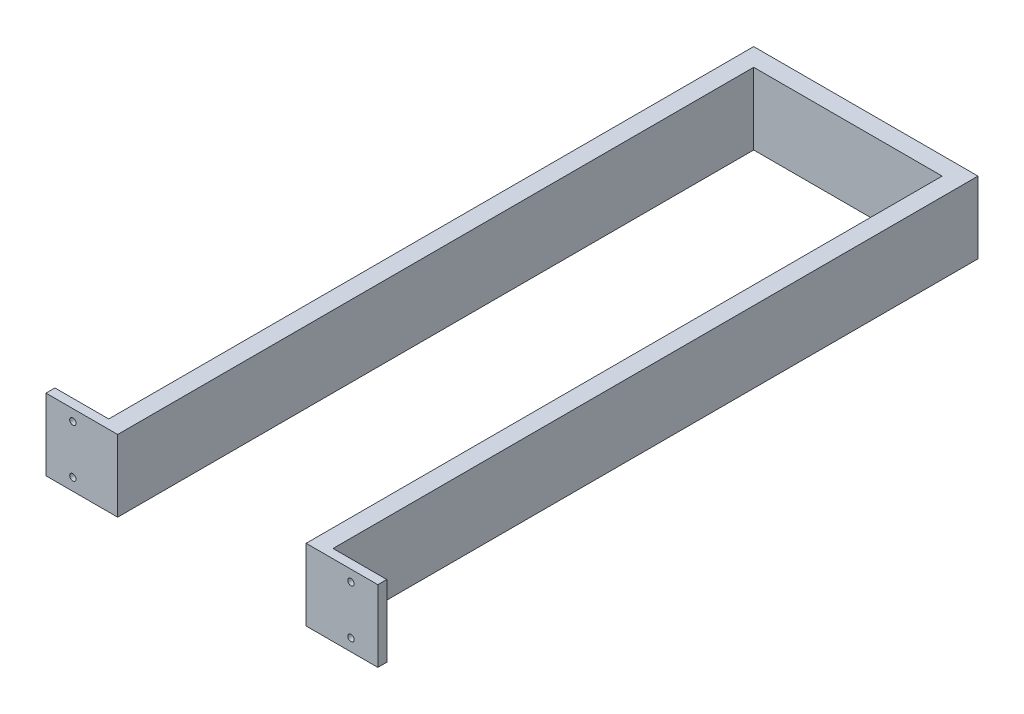
ISO-10303-21;
HEADER;
FILE_DESCRIPTION(('STEP AP214'),'2;1');
FILE_NAME('part.step','',(''),(''),'','','');
FILE_SCHEMA(('AUTOMOTIVE_DESIGN { 1 0 10303 214 1 1 1 1 }'));
ENDSEC;
DATA;
#1=APPLICATION_CONTEXT('core data for automotive mechanical design processes');
#2=APPLICATION_PROTOCOL_DEFINITION('international standard','automotive_design',2000,#1);
#3=PRODUCT_CONTEXT('',#1,'mechanical');
#4=PRODUCT('Part','Part','',(#3));
#5=PRODUCT_RELATED_PRODUCT_CATEGORY('part','',(#4));
#6=PRODUCT_DEFINITION_FORMATION('','',#4);
#7=PRODUCT_DEFINITION_CONTEXT('part definition',#1,'design');
#8=PRODUCT_DEFINITION('design','',#6,#7);
#9=PRODUCT_DEFINITION_SHAPE('','',#8);
#10=(LENGTH_UNIT() NAMED_UNIT(*) SI_UNIT(.MILLI.,.METRE.));
#11=(NAMED_UNIT(*) PLANE_ANGLE_UNIT() SI_UNIT($,.RADIAN.));
#12=(NAMED_UNIT(*) SI_UNIT($,.STERADIAN.) SOLID_ANGLE_UNIT());
#13=UNCERTAINTY_MEASURE_WITH_UNIT(LENGTH_MEASURE(1.E-05),#10,'distance_accuracy_value','');
#14=(GEOMETRIC_REPRESENTATION_CONTEXT(3) GLOBAL_UNCERTAINTY_ASSIGNED_CONTEXT((#13)) GLOBAL_UNIT_ASSIGNED_CONTEXT((#10,
#11,#12)) REPRESENTATION_CONTEXT('',''));
#15=CARTESIAN_POINT('',(0.,0.,0.));
#16=DIRECTION('',(0.,0.,1.));
#17=DIRECTION('',(1.,0.,0.));
#18=AXIS2_PLACEMENT_3D('',#15,#16,#17);
#19=CARTESIAN_POINT('',(0.,0.,0.));
#20=DIRECTION('',(0.,0.,1.));
#21=DIRECTION('',(1.,0.,0.));
#22=AXIS2_PLACEMENT_3D('',#19,#20,#21);
#23=PLANE('',#22);
#24=CARTESIAN_POINT('',(-3.175,8.74663923210821,0.));
#25=DIRECTION('',(0.,0.,-1.));
#26=DIRECTION('',(-1.,0.,0.));
#27=AXIS2_PLACEMENT_3D('',#24,#25,#26);
#28=CIRCLE('',#27,1.13029999999999);
#29=CARTESIAN_POINT('',(-4.30529999999999,8.74663923210821,0.));
#30=VERTEX_POINT('',#29);
#31=EDGE_CURVE('E215',#30,#30,#28,.T.);
#32=ORIENTED_EDGE('',*,*,#31,.F.);
#33=EDGE_LOOP('',(#32));
#34=FACE_BOUND('',#33,.T.);
#35=CARTESIAN_POINT('',(-3.175,-8.39315376789179,0.));
#36=DIRECTION('',(0.,0.,-1.));
#37=DIRECTION('',(-1.,0.,0.));
#38=AXIS2_PLACEMENT_3D('',#35,#36,#37);
#39=CIRCLE('',#38,1.13029999999999);
#40=CARTESIAN_POINT('',(-4.30529999999999,-8.39315376789179,0.));
#41=VERTEX_POINT('',#40);
#42=EDGE_CURVE('E222',#41,#41,#39,.T.);
#43=ORIENTED_EDGE('',*,*,#42,.F.);
#44=EDGE_LOOP('',(#43));
#45=FACE_BOUND('',#44,.T.);
#46=DIRECTION('',(0.,1.,0.));
#47=VECTOR('',#46,1.);
#48=CARTESIAN_POINT('',(6.35,-12.7,0.));
#49=LINE('',#48,#47);
#50=CARTESIAN_POINT('',(6.35,-12.7,0.));
#51=VERTEX_POINT('',#50);
#52=CARTESIAN_POINT('',(6.35,12.7,0.));
#53=VERTEX_POINT('',#52);
#54=EDGE_CURVE('E230',#51,#53,#49,.T.);
#55=ORIENTED_EDGE('',*,*,#54,.F.);
#56=DIRECTION('',(1.,0.,0.));
#57=VECTOR('',#56,1.);
#58=CARTESIAN_POINT('',(-12.7,-12.7,0.));
#59=LINE('',#58,#57);
#60=CARTESIAN_POINT('',(-12.7,-12.7,0.));
#61=VERTEX_POINT('',#60);
#62=EDGE_CURVE('E272',#61,#51,#59,.T.);
#63=ORIENTED_EDGE('',*,*,#62,.F.);
#64=DIRECTION('',(0.,-1.,0.));
#65=VECTOR('',#64,1.);
#66=CARTESIAN_POINT('',(-12.7,12.7,0.));
#67=LINE('',#66,#65);
#68=CARTESIAN_POINT('',(-12.7,12.7,0.));
#69=VERTEX_POINT('',#68);
#70=EDGE_CURVE('E249',#69,#61,#67,.T.);
#71=ORIENTED_EDGE('',*,*,#70,.F.);
#72=DIRECTION('',(1.,0.,0.));
#73=VECTOR('',#72,1.);
#74=CARTESIAN_POINT('',(-12.7,12.7,0.));
#75=LINE('',#74,#73);
#76=EDGE_CURVE('E259',#69,#53,#75,.T.);
#77=ORIENTED_EDGE('',*,*,#76,.T.);
#78=EDGE_LOOP('',(#55,#63,#71,#77));
#79=FACE_BOUND('',#78,.T.);
#80=ADVANCED_FACE('F50',(#34,#45,#79),#23,.F.);
#81=CARTESIAN_POINT('',(-12.7,12.7,3.175));
#82=DIRECTION('',(1.,0.,0.));
#83=DIRECTION('',(0.,1.,0.));
#84=AXIS2_PLACEMENT_3D('',#81,#82,#83);
#85=PLANE('',#84);
#86=ORIENTED_EDGE('',*,*,#70,.T.);
#87=DIRECTION('',(0.,0.,-1.));
#88=VECTOR('',#87,1.);
#89=CARTESIAN_POINT('',(-12.7,-12.7,3.175));
#90=LINE('',#89,#88);
#91=CARTESIAN_POINT('',(-12.7,-12.7,3.175));
#92=VERTEX_POINT('',#91);
#93=EDGE_CURVE('E11',#92,#61,#90,.T.);
#94=ORIENTED_EDGE('',*,*,#93,.F.);
#95=DIRECTION('',(0.,-1.,0.));
#96=VECTOR('',#95,1.);
#97=CARTESIAN_POINT('',(-12.7,12.7,3.175));
#98=LINE('',#97,#96);
#99=CARTESIAN_POINT('',(-12.7,12.7,3.175));
#100=VERTEX_POINT('',#99);
#101=EDGE_CURVE('E252',#100,#92,#98,.T.);
#102=ORIENTED_EDGE('',*,*,#101,.F.);
#103=DIRECTION('',(0.,0.,-1.));
#104=VECTOR('',#103,1.);
#105=CARTESIAN_POINT('',(-12.7,12.7,3.175));
#106=LINE('',#105,#104);
#107=EDGE_CURVE('E270',#100,#69,#106,.T.);
#108=ORIENTED_EDGE('',*,*,#107,.T.);
#109=EDGE_LOOP('',(#86,#94,#102,#108));
#110=FACE_BOUND('',#109,.T.);
#111=ADVANCED_FACE('F47',(#110),#85,.F.);
#112=CARTESIAN_POINT('',(-12.7,-12.7,3.175));
#113=DIRECTION('',(0.,1.,0.));
#114=DIRECTION('',(0.,0.,1.));
#115=AXIS2_PLACEMENT_3D('',#112,#113,#114);
#116=PLANE('',#115);
#117=ORIENTED_EDGE('',*,*,#62,.T.);
#118=DIRECTION('',(0.,0.,1.));
#119=VECTOR('',#118,1.);
#120=CARTESIAN_POINT('',(6.35,-12.7,-228.6));
#121=LINE('',#120,#119);
#122=CARTESIAN_POINT('',(6.35,-12.7,-228.6));
#123=VERTEX_POINT('',#122);
#124=EDGE_CURVE('E246',#123,#51,#121,.T.);
#125=ORIENTED_EDGE('',*,*,#124,.F.);
#126=DIRECTION('',(-1.,0.,0.));
#127=VECTOR('',#126,1.);
#128=CARTESIAN_POINT('',(12.7,-12.7,-228.6));
#129=LINE('',#128,#127);
#130=CARTESIAN_POINT('',(85.852,-12.7,-228.6));
#131=VERTEX_POINT('',#130);
#132=EDGE_CURVE('E229',#131,#123,#129,.T.);
#133=ORIENTED_EDGE('',*,*,#132,.F.);
#134=DIRECTION('',(0.,0.,1.));
#135=VECTOR('',#134,1.);
#136=CARTESIAN_POINT('',(85.852,-12.7,-228.6));
#137=LINE('',#136,#135);
#138=CARTESIAN_POINT('',(85.852,-12.7,0.));
#139=VERTEX_POINT('',#138);
#140=EDGE_CURVE('E199',#131,#139,#137,.T.);
#141=ORIENTED_EDGE('',*,*,#140,.T.);
#142=DIRECTION('',(1.,0.,0.));
#143=VECTOR('',#142,1.);
#144=CARTESIAN_POINT('',(79.502,-12.7,0.));
#145=LINE('',#144,#143);
#146=CARTESIAN_POINT('',(104.902,-12.7,0.));
#147=VERTEX_POINT('',#146);
#148=EDGE_CURVE('E156',#139,#147,#145,.T.);
#149=ORIENTED_EDGE('',*,*,#148,.T.);
#150=DIRECTION('',(0.,0.,-1.));
#151=VECTOR('',#150,1.);
#152=CARTESIAN_POINT('',(104.902,-12.7,3.175));
#153=LINE('',#152,#151);
#154=CARTESIAN_POINT('',(104.902,-12.7,3.175));
#155=VERTEX_POINT('',#154);
#156=EDGE_CURVE('E181',#155,#147,#153,.T.);
#157=ORIENTED_EDGE('',*,*,#156,.F.);
#158=DIRECTION('',(1.,0.,0.));
#159=VECTOR('',#158,1.);
#160=CARTESIAN_POINT('',(79.502,-12.7,3.175));
#161=LINE('',#160,#159);
#162=CARTESIAN_POINT('',(79.502,-12.7,3.175));
#163=VERTEX_POINT('',#162);
#164=EDGE_CURVE('E171',#163,#155,#161,.T.);
#165=ORIENTED_EDGE('',*,*,#164,.F.);
#166=DIRECTION('',(0.,0.,-1.));
#167=VECTOR('',#166,1.);
#168=CARTESIAN_POINT('',(79.502,-12.7,0.));
#169=LINE('',#168,#167);
#170=CARTESIAN_POINT('',(79.502,-12.7,-222.25));
#171=VERTEX_POINT('',#170);
#172=EDGE_CURVE('E149',#163,#171,#169,.T.);
#173=ORIENTED_EDGE('',*,*,#172,.T.);
#174=DIRECTION('',(-1.,0.,0.));
#175=VECTOR('',#174,1.);
#176=CARTESIAN_POINT('',(85.852,-12.7,-222.25));
#177=LINE('',#176,#175);
#178=CARTESIAN_POINT('',(12.7,-12.7,-222.25));
#179=VERTEX_POINT('',#178);
#180=EDGE_CURVE('E207',#171,#179,#177,.T.);
#181=ORIENTED_EDGE('',*,*,#180,.T.);
#182=DIRECTION('',(0.,0.,-1.));
#183=VECTOR('',#182,1.);
#184=CARTESIAN_POINT('',(12.7,-12.7,3.175));
#185=LINE('',#184,#183);
#186=CARTESIAN_POINT('',(12.7,-12.7,3.175));
#187=VERTEX_POINT('',#186);
#188=EDGE_CURVE('E57',#187,#179,#185,.T.);
#189=ORIENTED_EDGE('',*,*,#188,.F.);
#190=DIRECTION('',(1.,0.,0.));
#191=VECTOR('',#190,1.);
#192=CARTESIAN_POINT('',(-12.7,-12.7,3.175));
#193=LINE('',#192,#191);
#194=EDGE_CURVE('E253',#92,#187,#193,.T.);
#195=ORIENTED_EDGE('',*,*,#194,.F.);
#196=ORIENTED_EDGE('',*,*,#93,.T.);
#197=EDGE_LOOP('',(#117,#125,#133,#141,#149,#157,#165,#173,#181,#189,#195,#196));
#198=FACE_BOUND('',#197,.T.);
#199=ADVANCED_FACE('F286',(#198),#116,.F.);
#200=CARTESIAN_POINT('',(12.7,12.7,3.175));
#201=DIRECTION('',(1.,0.,0.));
#202=DIRECTION('',(0.,1.,0.));
#203=AXIS2_PLACEMENT_3D('',#200,#201,#202);
#204=PLANE('',#203);
#205=DIRECTION('',(0.,-1.,0.));
#206=VECTOR('',#205,1.);
#207=CARTESIAN_POINT('',(12.7,12.7,-222.25));
#208=LINE('',#207,#206);
#209=CARTESIAN_POINT('',(12.7,12.7,-222.25));
#210=VERTEX_POINT('',#209);
#211=EDGE_CURVE('E143',#210,#179,#208,.T.);
#212=ORIENTED_EDGE('',*,*,#211,.F.);
#213=DIRECTION('',(0.,0.,-1.));
#214=VECTOR('',#213,1.);
#215=CARTESIAN_POINT('',(12.7,12.7,3.175));
#216=LINE('',#215,#214);
#217=CARTESIAN_POINT('',(12.7,12.7,3.175));
#218=VERTEX_POINT('',#217);
#219=EDGE_CURVE('E278',#218,#210,#216,.T.);
#220=ORIENTED_EDGE('',*,*,#219,.F.);
#221=DIRECTION('',(0.,-1.,0.));
#222=VECTOR('',#221,1.);
#223=CARTESIAN_POINT('',(12.7,12.7,3.175));
#224=LINE('',#223,#222);
#225=EDGE_CURVE('E258',#218,#187,#224,.T.);
#226=ORIENTED_EDGE('',*,*,#225,.T.);
#227=ORIENTED_EDGE('',*,*,#188,.T.);
#228=EDGE_LOOP('',(#212,#220,#226,#227));
#229=FACE_BOUND('',#228,.T.);
#230=ADVANCED_FACE('F282',(#229),#204,.T.);
#231=CARTESIAN_POINT('',(-12.7,12.7,3.175));
#232=DIRECTION('',(0.,1.,0.));
#233=DIRECTION('',(0.,0.,1.));
#234=AXIS2_PLACEMENT_3D('',#231,#232,#233);
#235=PLANE('',#234);
#236=ORIENTED_EDGE('',*,*,#76,.F.);
#237=ORIENTED_EDGE('',*,*,#107,.F.);
#238=DIRECTION('',(1.,0.,0.));
#239=VECTOR('',#238,1.);
#240=CARTESIAN_POINT('',(-12.7,12.7,3.175));
#241=LINE('',#240,#239);
#242=EDGE_CURVE('E261',#100,#218,#241,.T.);
#243=ORIENTED_EDGE('',*,*,#242,.T.);
#244=ORIENTED_EDGE('',*,*,#219,.T.);
#245=DIRECTION('',(-1.,0.,0.));
#246=VECTOR('',#245,1.);
#247=CARTESIAN_POINT('',(85.852,12.7,-222.25));
#248=LINE('',#247,#246);
#249=CARTESIAN_POINT('',(79.502,12.7,-222.25));
#250=VERTEX_POINT('',#249);
#251=EDGE_CURVE('E67',#250,#210,#248,.T.);
#252=ORIENTED_EDGE('',*,*,#251,.F.);
#253=DIRECTION('',(0.,0.,-1.));
#254=VECTOR('',#253,1.);
#255=CARTESIAN_POINT('',(79.502,12.7,0.));
#256=LINE('',#255,#254);
#257=CARTESIAN_POINT('',(79.502,12.7,3.175));
#258=VERTEX_POINT('',#257);
#259=EDGE_CURVE('E65',#258,#250,#256,.T.);
#260=ORIENTED_EDGE('',*,*,#259,.F.);
#261=DIRECTION('',(1.,0.,0.));
#262=VECTOR('',#261,1.);
#263=CARTESIAN_POINT('',(79.502,12.7,3.175));
#264=LINE('',#263,#262);
#265=CARTESIAN_POINT('',(104.902,12.7,3.175));
#266=VERTEX_POINT('',#265);
#267=EDGE_CURVE('E145',#258,#266,#264,.T.);
#268=ORIENTED_EDGE('',*,*,#267,.T.);
#269=DIRECTION('',(0.,0.,-1.));
#270=VECTOR('',#269,1.);
#271=CARTESIAN_POINT('',(104.902,12.7,3.175));
#272=LINE('',#271,#270);
#273=CARTESIAN_POINT('',(104.902,12.7,0.));
#274=VERTEX_POINT('',#273);
#275=EDGE_CURVE('E172',#266,#274,#272,.T.);
#276=ORIENTED_EDGE('',*,*,#275,.T.);
#277=DIRECTION('',(1.,0.,0.));
#278=VECTOR('',#277,1.);
#279=CARTESIAN_POINT('',(79.502,12.7,0.));
#280=LINE('',#279,#278);
#281=CARTESIAN_POINT('',(85.852,12.7,0.));
#282=VERTEX_POINT('',#281);
#283=EDGE_CURVE('E174',#282,#274,#280,.T.);
#284=ORIENTED_EDGE('',*,*,#283,.F.);
#285=DIRECTION('',(0.,0.,1.));
#286=VECTOR('',#285,1.);
#287=CARTESIAN_POINT('',(85.852,12.7,-228.6));
#288=LINE('',#287,#286);
#289=CARTESIAN_POINT('',(85.852,12.7,-228.6));
#290=VERTEX_POINT('',#289);
#291=EDGE_CURVE('E198',#290,#282,#288,.T.);
#292=ORIENTED_EDGE('',*,*,#291,.F.);
#293=DIRECTION('',(1.,0.,0.));
#294=VECTOR('',#293,1.);
#295=CARTESIAN_POINT('',(12.7,12.7,-228.6));
#296=LINE('',#295,#294);
#297=CARTESIAN_POINT('',(6.35,12.7,-228.6));
#298=VERTEX_POINT('',#297);
#299=EDGE_CURVE('E236',#298,#290,#296,.T.);
#300=ORIENTED_EDGE('',*,*,#299,.F.);
#301=DIRECTION('',(0.,0.,1.));
#302=VECTOR('',#301,1.);
#303=CARTESIAN_POINT('',(6.35,12.7,-228.6));
#304=LINE('',#303,#302);
#305=EDGE_CURVE('E237',#298,#53,#304,.T.);
#306=ORIENTED_EDGE('',*,*,#305,.T.);
#307=EDGE_LOOP('',(#236,#237,#243,#244,#252,#260,#268,#276,#284,#292,#300,#306));
#308=FACE_BOUND('',#307,.T.);
#309=ADVANCED_FACE('F136',(#308),#235,.T.);
#310=CARTESIAN_POINT('',(0.,0.,3.175));
#311=DIRECTION('',(0.,0.,1.));
#312=DIRECTION('',(1.,0.,0.));
#313=AXIS2_PLACEMENT_3D('',#310,#311,#312);
#314=PLANE('',#313);
#315=CARTESIAN_POINT('',(-3.175,8.74663923210821,3.175));
#316=DIRECTION('',(0.,0.,-1.));
#317=DIRECTION('',(-1.,0.,0.));
#318=AXIS2_PLACEMENT_3D('',#315,#316,#317);
#319=CIRCLE('',#318,1.1303);
#320=CARTESIAN_POINT('',(-4.3053,8.74663923210821,3.175));
#321=VERTEX_POINT('',#320);
#322=EDGE_CURVE('E220',#321,#321,#319,.T.);
#323=ORIENTED_EDGE('',*,*,#322,.T.);
#324=EDGE_LOOP('',(#323));
#325=FACE_BOUND('',#324,.T.);
#326=CARTESIAN_POINT('',(-3.175,-8.39315376789179,3.175));
#327=DIRECTION('',(0.,0.,-1.));
#328=DIRECTION('',(-1.,0.,0.));
#329=AXIS2_PLACEMENT_3D('',#326,#327,#328);
#330=CIRCLE('',#329,1.1303);
#331=CARTESIAN_POINT('',(-4.3053,-8.39315376789179,3.175));
#332=VERTEX_POINT('',#331);
#333=EDGE_CURVE('E221',#332,#332,#330,.T.);
#334=ORIENTED_EDGE('',*,*,#333,.T.);
#335=EDGE_LOOP('',(#334));
#336=FACE_BOUND('',#335,.T.);
#337=ORIENTED_EDGE('',*,*,#101,.T.);
#338=ORIENTED_EDGE('',*,*,#194,.T.);
#339=ORIENTED_EDGE('',*,*,#225,.F.);
#340=ORIENTED_EDGE('',*,*,#242,.F.);
#341=EDGE_LOOP('',(#337,#338,#339,#340));
#342=FACE_BOUND('',#341,.T.);
#343=ADVANCED_FACE('F318',(#325,#336,#342),#314,.T.);
#344=CARTESIAN_POINT('',(6.35,-12.7,-228.6));
#345=DIRECTION('',(1.,0.,0.));
#346=DIRECTION('',(0.,0.,-1.));
#347=AXIS2_PLACEMENT_3D('',#344,#345,#346);
#348=PLANE('',#347);
#349=ORIENTED_EDGE('',*,*,#54,.T.);
#350=ORIENTED_EDGE('',*,*,#305,.F.);
#351=DIRECTION('',(0.,1.,0.));
#352=VECTOR('',#351,1.);
#353=CARTESIAN_POINT('',(6.35,-12.7,-228.6));
#354=LINE('',#353,#352);
#355=EDGE_CURVE('E231',#123,#298,#354,.T.);
#356=ORIENTED_EDGE('',*,*,#355,.F.);
#357=ORIENTED_EDGE('',*,*,#124,.T.);
#358=EDGE_LOOP('',(#349,#350,#356,#357));
#359=FACE_BOUND('',#358,.T.);
#360=ADVANCED_FACE('F315',(#359),#348,.F.);
#361=CARTESIAN_POINT('',(0.,0.,-228.6));
#362=DIRECTION('',(0.,0.,1.));
#363=DIRECTION('',(1.,0.,0.));
#364=AXIS2_PLACEMENT_3D('',#361,#362,#363);
#365=PLANE('',#364);
#366=ORIENTED_EDGE('',*,*,#299,.T.);
#367=DIRECTION('',(0.,-1.,0.));
#368=VECTOR('',#367,1.);
#369=CARTESIAN_POINT('',(85.852,12.7,-228.6));
#370=LINE('',#369,#368);
#371=EDGE_CURVE('E205',#290,#131,#370,.T.);
#372=ORIENTED_EDGE('',*,*,#371,.T.);
#373=ORIENTED_EDGE('',*,*,#132,.T.);
#374=ORIENTED_EDGE('',*,*,#355,.T.);
#375=EDGE_LOOP('',(#366,#372,#373,#374));
#376=FACE_BOUND('',#375,.T.);
#377=ADVANCED_FACE('F310',(#376),#365,.F.);
#378=CARTESIAN_POINT('',(-3.175,-8.39315376789179,0.));
#379=DIRECTION('',(0.,0.,-1.));
#380=DIRECTION('',(-1.,0.,0.));
#381=AXIS2_PLACEMENT_3D('',#378,#379,#380);
#382=CYLINDRICAL_SURFACE('',#381,1.13029999999999);
#383=ORIENTED_EDGE('',*,*,#333,.F.);
#384=EDGE_LOOP('',(#383));
#385=FACE_BOUND('',#384,.T.);
#386=ORIENTED_EDGE('',*,*,#42,.T.);
#387=EDGE_LOOP('',(#386));
#388=FACE_BOUND('',#387,.T.);
#389=ADVANCED_FACE('F441',(#385,#388),#382,.F.);
#390=CARTESIAN_POINT('',(-3.175,8.74663923210821,0.));
#391=DIRECTION('',(0.,0.,-1.));
#392=DIRECTION('',(-1.,0.,0.));
#393=AXIS2_PLACEMENT_3D('',#390,#391,#392);
#394=CYLINDRICAL_SURFACE('',#393,1.13029999999999);
#395=ORIENTED_EDGE('',*,*,#322,.F.);
#396=EDGE_LOOP('',(#395));
#397=FACE_BOUND('',#396,.T.);
#398=ORIENTED_EDGE('',*,*,#31,.T.);
#399=EDGE_LOOP('',(#398));
#400=FACE_BOUND('',#399,.T.);
#401=ADVANCED_FACE('F435',(#397,#400),#394,.F.);
#402=CARTESIAN_POINT('',(85.852,12.7,-222.25));
#403=DIRECTION('',(0.,0.,-1.));
#404=DIRECTION('',(-1.,0.,0.));
#405=AXIS2_PLACEMENT_3D('',#402,#403,#404);
#406=PLANE('',#405);
#407=ORIENTED_EDGE('',*,*,#180,.F.);
#408=DIRECTION('',(0.,1.,0.));
#409=VECTOR('',#408,1.);
#410=CARTESIAN_POINT('',(79.502,-12.7,-222.25));
#411=LINE('',#410,#409);
#412=EDGE_CURVE('E184',#171,#250,#411,.T.);
#413=ORIENTED_EDGE('',*,*,#412,.T.);
#414=ORIENTED_EDGE('',*,*,#251,.T.);
#415=ORIENTED_EDGE('',*,*,#211,.T.);
#416=EDGE_LOOP('',(#407,#413,#414,#415));
#417=FACE_BOUND('',#416,.T.);
#418=ADVANCED_FACE('F289',(#417),#406,.F.);
#419=CARTESIAN_POINT('',(85.852,0.,0.));
#420=DIRECTION('',(1.,0.,0.));
#421=DIRECTION('',(0.,1.,0.));
#422=AXIS2_PLACEMENT_3D('',#419,#420,#421);
#423=PLANE('',#422);
#424=ORIENTED_EDGE('',*,*,#291,.T.);
#425=DIRECTION('',(0.,1.,0.));
#426=VECTOR('',#425,1.);
#427=CARTESIAN_POINT('',(85.852,-12.7,0.));
#428=LINE('',#427,#426);
#429=EDGE_CURVE('E189',#139,#282,#428,.T.);
#430=ORIENTED_EDGE('',*,*,#429,.F.);
#431=ORIENTED_EDGE('',*,*,#140,.F.);
#432=ORIENTED_EDGE('',*,*,#371,.F.);
#433=EDGE_LOOP('',(#424,#430,#431,#432));
#434=FACE_BOUND('',#433,.T.);
#435=ADVANCED_FACE('F304',(#434),#423,.T.);
#436=CARTESIAN_POINT('',(79.502,-12.7,0.));
#437=DIRECTION('',(-1.,0.,0.));
#438=DIRECTION('',(0.,0.,1.));
#439=AXIS2_PLACEMENT_3D('',#436,#437,#438);
#440=PLANE('',#439);
#441=ORIENTED_EDGE('',*,*,#412,.F.);
#442=ORIENTED_EDGE('',*,*,#172,.F.);
#443=DIRECTION('',(0.,1.,0.));
#444=VECTOR('',#443,1.);
#445=CARTESIAN_POINT('',(79.502,-12.7,3.175));
#446=LINE('',#445,#444);
#447=EDGE_CURVE('E153',#163,#258,#446,.T.);
#448=ORIENTED_EDGE('',*,*,#447,.T.);
#449=ORIENTED_EDGE('',*,*,#259,.T.);
#450=EDGE_LOOP('',(#441,#442,#448,#449));
#451=FACE_BOUND('',#450,.T.);
#452=ADVANCED_FACE('F160',(#451),#440,.T.);
#453=CARTESIAN_POINT('',(104.902,-12.7,3.175));
#454=DIRECTION('',(-1.,0.,0.));
#455=DIRECTION('',(0.,0.,1.));
#456=AXIS2_PLACEMENT_3D('',#453,#454,#455);
#457=PLANE('',#456);
#458=DIRECTION('',(0.,1.,0.));
#459=VECTOR('',#458,1.);
#460=CARTESIAN_POINT('',(104.902,-12.7,0.));
#461=LINE('',#460,#459);
#462=EDGE_CURVE('E161',#147,#274,#461,.T.);
#463=ORIENTED_EDGE('',*,*,#462,.T.);
#464=ORIENTED_EDGE('',*,*,#275,.F.);
#465=DIRECTION('',(0.,1.,0.));
#466=VECTOR('',#465,1.);
#467=CARTESIAN_POINT('',(104.902,-12.7,3.175));
#468=LINE('',#467,#466);
#469=EDGE_CURVE('E151',#155,#266,#468,.T.);
#470=ORIENTED_EDGE('',*,*,#469,.F.);
#471=ORIENTED_EDGE('',*,*,#156,.T.);
#472=EDGE_LOOP('',(#463,#464,#470,#471));
#473=FACE_BOUND('',#472,.T.);
#474=ADVANCED_FACE('F294',(#473),#457,.F.);
#475=CARTESIAN_POINT('',(0.,0.,3.175));
#476=DIRECTION('',(0.,0.,-1.));
#477=DIRECTION('',(-1.,0.,0.));
#478=AXIS2_PLACEMENT_3D('',#475,#476,#477);
#479=PLANE('',#478);
#480=CARTESIAN_POINT('',(95.382,8.74663923210821,3.175));
#481=DIRECTION('',(0.,0.,1.));
#482=DIRECTION('',(1.,0.,0.));
#483=AXIS2_PLACEMENT_3D('',#480,#481,#482);
#484=CIRCLE('',#483,1.13029999999999);
#485=CARTESIAN_POINT('',(96.5123,8.74663923210821,3.175));
#486=VERTEX_POINT('',#485);
#487=EDGE_CURVE('E540',#486,#486,#484,.T.);
#488=ORIENTED_EDGE('',*,*,#487,.F.);
#489=EDGE_LOOP('',(#488));
#490=FACE_BOUND('',#489,.T.);
#491=CARTESIAN_POINT('',(95.382,-8.39315376789179,3.175));
#492=DIRECTION('',(0.,0.,1.));
#493=DIRECTION('',(1.,0.,0.));
#494=AXIS2_PLACEMENT_3D('',#491,#492,#493);
#495=CIRCLE('',#494,1.13029999999999);
#496=CARTESIAN_POINT('',(96.5123,-8.39315376789179,3.175));
#497=VERTEX_POINT('',#496);
#498=EDGE_CURVE('E535',#497,#497,#495,.T.);
#499=ORIENTED_EDGE('',*,*,#498,.F.);
#500=EDGE_LOOP('',(#499));
#501=FACE_BOUND('',#500,.T.);
#502=ORIENTED_EDGE('',*,*,#447,.F.);
#503=ORIENTED_EDGE('',*,*,#164,.T.);
#504=ORIENTED_EDGE('',*,*,#469,.T.);
#505=ORIENTED_EDGE('',*,*,#267,.F.);
#506=EDGE_LOOP('',(#502,#503,#504,#505));
#507=FACE_BOUND('',#506,.T.);
#508=ADVANCED_FACE('F147',(#490,#501,#507),#479,.F.);
#509=CARTESIAN_POINT('',(0.,0.,0.));
#510=DIRECTION('',(0.,0.,-1.));
#511=DIRECTION('',(-1.,0.,0.));
#512=AXIS2_PLACEMENT_3D('',#509,#510,#511);
#513=PLANE('',#512);
#514=CARTESIAN_POINT('',(95.382,8.74663923210821,0.));
#515=DIRECTION('',(0.,0.,-1.));
#516=DIRECTION('',(-1.,0.,0.));
#517=AXIS2_PLACEMENT_3D('',#514,#515,#516);
#518=CIRCLE('',#517,1.13029999999997);
#519=CARTESIAN_POINT('',(94.2517,8.74663923210821,0.));
#520=VERTEX_POINT('',#519);
#521=EDGE_CURVE('E528',#520,#520,#518,.T.);
#522=ORIENTED_EDGE('',*,*,#521,.F.);
#523=EDGE_LOOP('',(#522));
#524=FACE_BOUND('',#523,.T.);
#525=CARTESIAN_POINT('',(95.382,-8.39315376789179,0.));
#526=DIRECTION('',(0.,0.,-1.));
#527=DIRECTION('',(-1.,0.,0.));
#528=AXIS2_PLACEMENT_3D('',#525,#526,#527);
#529=CIRCLE('',#528,1.13029999999997);
#530=CARTESIAN_POINT('',(94.2517,-8.39315376789179,0.));
#531=VERTEX_POINT('',#530);
#532=EDGE_CURVE('E168',#531,#531,#529,.T.);
#533=ORIENTED_EDGE('',*,*,#532,.F.);
#534=EDGE_LOOP('',(#533));
#535=FACE_BOUND('',#534,.T.);
#536=ORIENTED_EDGE('',*,*,#148,.F.);
#537=ORIENTED_EDGE('',*,*,#429,.T.);
#538=ORIENTED_EDGE('',*,*,#283,.T.);
#539=ORIENTED_EDGE('',*,*,#462,.F.);
#540=EDGE_LOOP('',(#536,#537,#538,#539));
#541=FACE_BOUND('',#540,.T.);
#542=ADVANCED_FACE('F301',(#524,#535,#541),#513,.T.);
#543=CARTESIAN_POINT('',(95.382,-8.39315376789179,3.175));
#544=DIRECTION('',(0.,0.,1.));
#545=DIRECTION('',(1.,0.,0.));
#546=AXIS2_PLACEMENT_3D('',#543,#544,#545);
#547=CYLINDRICAL_SURFACE('',#546,1.13029999999997);
#548=ORIENTED_EDGE('',*,*,#532,.T.);
#549=EDGE_LOOP('',(#548));
#550=FACE_BOUND('',#549,.T.);
#551=ORIENTED_EDGE('',*,*,#498,.T.);
#552=EDGE_LOOP('',(#551));
#553=FACE_BOUND('',#552,.T.);
#554=ADVANCED_FACE('F379',(#550,#553),#547,.F.);
#555=CARTESIAN_POINT('',(95.382,8.74663923210821,3.175));
#556=DIRECTION('',(0.,0.,1.));
#557=DIRECTION('',(1.,0.,0.));
#558=AXIS2_PLACEMENT_3D('',#555,#556,#557);
#559=CYLINDRICAL_SURFACE('',#558,1.13029999999997);
#560=ORIENTED_EDGE('',*,*,#521,.T.);
#561=EDGE_LOOP('',(#560));
#562=FACE_BOUND('',#561,.T.);
#563=ORIENTED_EDGE('',*,*,#487,.T.);
#564=EDGE_LOOP('',(#563));
#565=FACE_BOUND('',#564,.T.);
#566=ADVANCED_FACE('F381',(#562,#565),#559,.F.);
#567=CLOSED_SHELL('',(#80,#111,#199,#230,#309,#343,#360,#377,#389,#401,#418,#435,#452,#474,#508,
#542,#554,#566));
#568=MANIFOLD_SOLID_BREP('B2',#567);
#569=ADVANCED_BREP_SHAPE_REPRESENTATION('',(#18,#568),#14);
#570=SHAPE_DEFINITION_REPRESENTATION(#9,#569);
ENDSEC;
END-ISO-10303-21;
